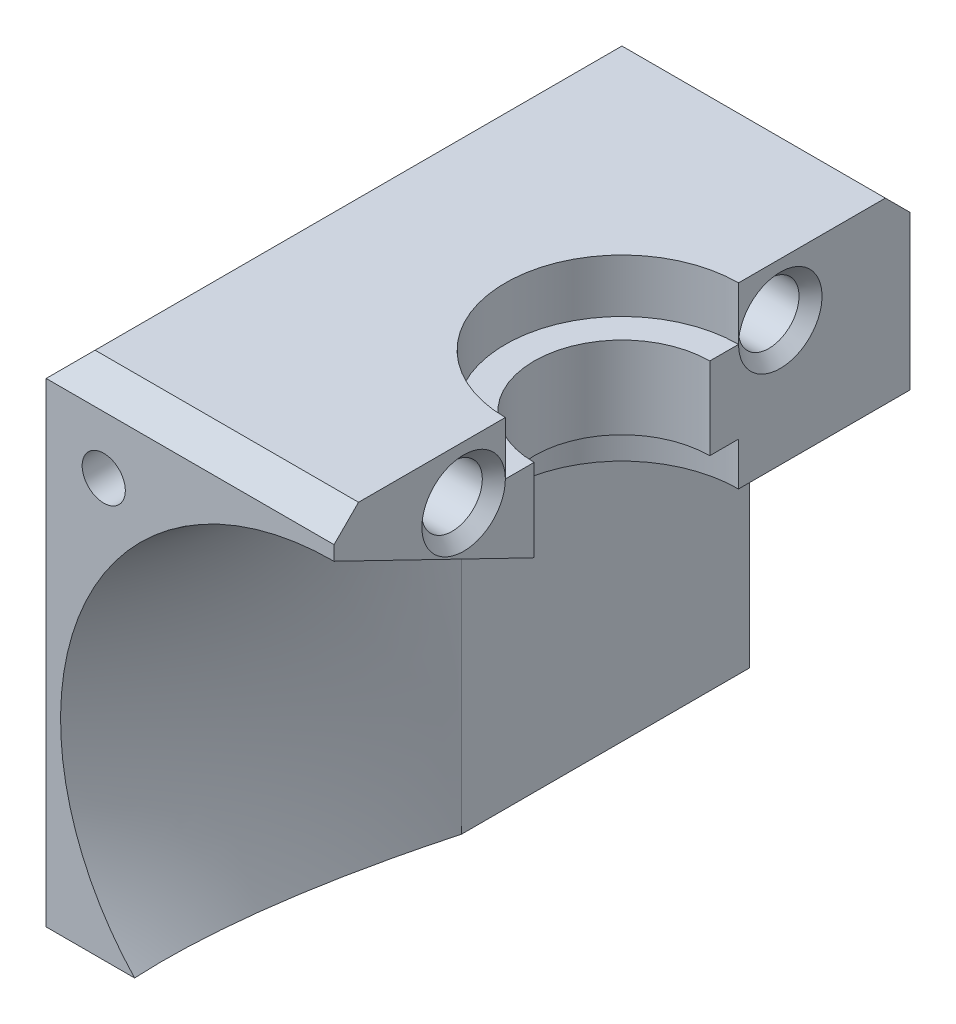
ISO-10303-21;
HEADER;
FILE_DESCRIPTION(('STEP AP214'),'2;1');
FILE_NAME('part.step','',(''),(''),'','','');
FILE_SCHEMA(('AUTOMOTIVE_DESIGN { 1 0 10303 214 1 1 1 1 }'));
ENDSEC;
DATA;
#1=APPLICATION_CONTEXT('core data for automotive mechanical design processes');
#2=APPLICATION_PROTOCOL_DEFINITION('international standard','automotive_design',2000,#1);
#3=PRODUCT_CONTEXT('',#1,'mechanical');
#4=PRODUCT('Part','Part','',(#3));
#5=PRODUCT_RELATED_PRODUCT_CATEGORY('part','',(#4));
#6=PRODUCT_DEFINITION_FORMATION('','',#4);
#7=PRODUCT_DEFINITION_CONTEXT('part definition',#1,'design');
#8=PRODUCT_DEFINITION('design','',#6,#7);
#9=PRODUCT_DEFINITION_SHAPE('','',#8);
#10=(LENGTH_UNIT() NAMED_UNIT(*) SI_UNIT(.MILLI.,.METRE.));
#11=(NAMED_UNIT(*) PLANE_ANGLE_UNIT() SI_UNIT($,.RADIAN.));
#12=(NAMED_UNIT(*) SI_UNIT($,.STERADIAN.) SOLID_ANGLE_UNIT());
#13=UNCERTAINTY_MEASURE_WITH_UNIT(LENGTH_MEASURE(1.E-05),#10,'distance_accuracy_value','');
#14=(GEOMETRIC_REPRESENTATION_CONTEXT(3) GLOBAL_UNCERTAINTY_ASSIGNED_CONTEXT((#13)) GLOBAL_UNIT_ASSIGNED_CONTEXT((#10,
#11,#12)) REPRESENTATION_CONTEXT('',''));
#15=CARTESIAN_POINT('',(0.,0.,0.));
#16=DIRECTION('',(0.,0.,1.));
#17=DIRECTION('',(1.,0.,0.));
#18=AXIS2_PLACEMENT_3D('',#15,#16,#17);
#19=CARTESIAN_POINT('',(20.,34.7,0.));
#20=DIRECTION('',(-1.,0.,0.));
#21=DIRECTION('',(0.,0.,1.));
#22=AXIS2_PLACEMENT_3D('',#19,#20,#21);
#23=PLANE('',#22);
#24=DIRECTION('',(0.,0.,-1.));
#25=VECTOR('',#24,1.);
#26=CARTESIAN_POINT('',(20.,31.,0.));
#27=LINE('',#26,#25);
#28=CARTESIAN_POINT('',(20.,31.,-11.9));
#29=VERTEX_POINT('',#28);
#30=CARTESIAN_POINT('',(20.,31.,-13.9));
#31=VERTEX_POINT('',#30);
#32=EDGE_CURVE('E460',#29,#31,#27,.T.);
#33=ORIENTED_EDGE('',*,*,#32,.F.);
#34=CARTESIAN_POINT('',(20.,31.,-9.));
#35=DIRECTION('',(-1.,0.,0.));
#36=DIRECTION('',(0.,0.,1.));
#37=AXIS2_PLACEMENT_3D('',#34,#35,#36);
#38=CIRCLE('',#37,2.9);
#39=EDGE_CURVE('E284',#29,#29,#38,.T.);
#40=ORIENTED_EDGE('',*,*,#39,.T.);
#41=DIRECTION('',(0.,1.,0.));
#42=VECTOR('',#41,1.);
#43=CARTESIAN_POINT('',(20.,31.,-11.9));
#44=LINE('',#43,#42);
#45=CARTESIAN_POINT('',(20.,34.7,-11.9));
#46=VERTEX_POINT('',#45);
#47=EDGE_CURVE('E465',#29,#46,#44,.T.);
#48=ORIENTED_EDGE('',*,*,#47,.T.);
#49=DIRECTION('',(0.,0.,-1.));
#50=VECTOR('',#49,1.);
#51=CARTESIAN_POINT('',(20.,34.7,0.));
#52=LINE('',#51,#50);
#53=CARTESIAN_POINT('',(20.,34.7,-1.69999999999999));
#54=VERTEX_POINT('',#53);
#55=EDGE_CURVE('E247',#54,#46,#52,.T.);
#56=ORIENTED_EDGE('',*,*,#55,.F.);
#57=DIRECTION('',(0.,0.707106781186549,-0.707106781186546));
#58=VECTOR('',#57,1.);
#59=CARTESIAN_POINT('',(20.,34.7,-1.69999999999999));
#60=LINE('',#59,#58);
#61=CARTESIAN_POINT('',(20.,33.,0.));
#62=VERTEX_POINT('',#61);
#63=EDGE_CURVE('E88',#54,#62,#60,.F.);
#64=ORIENTED_EDGE('',*,*,#63,.T.);
#65=DIRECTION('',(0.,-1.,0.));
#66=VECTOR('',#65,1.);
#67=CARTESIAN_POINT('',(20.,34.7,0.));
#68=LINE('',#67,#66);
#69=CARTESIAN_POINT('',(20.,32.,0.));
#70=VERTEX_POINT('',#69);
#71=EDGE_CURVE('E249',#62,#70,#68,.T.);
#72=ORIENTED_EDGE('',*,*,#71,.T.);
#73=CARTESIAN_POINT('',(20.,32.,0.));
#74=CARTESIAN_POINT('',(20.,30.8764166666667,-2.31666666666667));
#75=CARTESIAN_POINT('',(20.,29.7528333333333,-4.63333333333333));
#76=CARTESIAN_POINT('',(20.,27.5056666666667,-9.26666666666667));
#77=CARTESIAN_POINT('',(20.,26.3820833333333,-11.5833333333333));
#78=CARTESIAN_POINT('',(20.,25.2585,-13.9));
#79=B_SPLINE_CURVE_WITH_KNOTS('',3,(#73,#74,#75,#76,#77,#78),.UNSPECIFIED.,.F.,.F.,(4,2,4),(0.,
7.72427702523026,15.4485540504605),.UNSPECIFIED.);
#80=CARTESIAN_POINT('',(20.,25.3,-13.8144329896907));
#81=VERTEX_POINT('',#80);
#82=EDGE_CURVE('E326',#70,#81,#79,.T.);
#83=ORIENTED_EDGE('',*,*,#82,.T.);
#84=DIRECTION('',(0.,0.,-1.));
#85=VECTOR('',#84,1.);
#86=CARTESIAN_POINT('',(20.,25.3,0.));
#87=LINE('',#86,#85);
#88=CARTESIAN_POINT('',(20.,25.3,-13.9));
#89=VERTEX_POINT('',#88);
#90=EDGE_CURVE('E450',#81,#89,#87,.T.);
#91=ORIENTED_EDGE('',*,*,#90,.T.);
#92=DIRECTION('',(0.,1.,0.));
#93=VECTOR('',#92,1.);
#94=CARTESIAN_POINT('',(20.,-10.3,-13.9));
#95=LINE('',#94,#93);
#96=EDGE_CURVE('E471',#89,#31,#95,.T.);
#97=ORIENTED_EDGE('',*,*,#96,.T.);
#98=EDGE_LOOP('',(#33,#40,#48,#56,#64,#72,#83,#91,#97));
#99=FACE_BOUND('',#98,.T.);
#100=ADVANCED_FACE('F64',(#99),#23,.F.);
#101=DIRECTION('',(0.,1.,0.));
#102=VECTOR('',#101,1.);
#103=CARTESIAN_POINT('',(20.,31.,-28.1));
#104=LINE('',#103,#102);
#105=CARTESIAN_POINT('',(20.,34.7,-28.1));
#106=VERTEX_POINT('',#105);
#107=CARTESIAN_POINT('',(20.,31.,-28.1));
#108=VERTEX_POINT('',#107);
#109=EDGE_CURVE('E462',#106,#108,#104,.F.);
#110=ORIENTED_EDGE('',*,*,#109,.T.);
#111=CARTESIAN_POINT('',(20.,31.,-31.));
#112=DIRECTION('',(-1.,0.,0.));
#113=DIRECTION('',(0.,0.,1.));
#114=AXIS2_PLACEMENT_3D('',#111,#112,#113);
#115=CIRCLE('',#114,2.90000000000002);
#116=EDGE_CURVE('E12',#108,#108,#115,.T.);
#117=ORIENTED_EDGE('',*,*,#116,.T.);
#118=DIRECTION('',(0.,0.,-1.));
#119=VECTOR('',#118,1.);
#120=CARTESIAN_POINT('',(20.,31.,0.));
#121=LINE('',#120,#119);
#122=CARTESIAN_POINT('',(20.,31.,-26.1));
#123=VERTEX_POINT('',#122);
#124=EDGE_CURVE('E456',#123,#108,#121,.T.);
#125=ORIENTED_EDGE('',*,*,#124,.F.);
#126=DIRECTION('',(0.,1.,0.));
#127=VECTOR('',#126,1.);
#128=CARTESIAN_POINT('',(20.,-10.3,-26.1));
#129=LINE('',#128,#127);
#130=CARTESIAN_POINT('',(20.,25.3,-26.1));
#131=VERTEX_POINT('',#130);
#132=EDGE_CURVE('E468',#123,#131,#129,.F.);
#133=ORIENTED_EDGE('',*,*,#132,.T.);
#134=DIRECTION('',(0.,0.,-1.));
#135=VECTOR('',#134,1.);
#136=CARTESIAN_POINT('',(20.,25.3,0.));
#137=LINE('',#136,#135);
#138=CARTESIAN_POINT('',(20.,25.3,-28.1));
#139=VERTEX_POINT('',#138);
#140=EDGE_CURVE('E429',#131,#139,#137,.T.);
#141=ORIENTED_EDGE('',*,*,#140,.T.);
#142=DIRECTION('',(0.,1.,0.));
#143=VECTOR('',#142,1.);
#144=CARTESIAN_POINT('',(20.,22.3,-28.1));
#145=LINE('',#144,#143);
#146=CARTESIAN_POINT('',(20.,22.3,-28.1));
#147=VERTEX_POINT('',#146);
#148=EDGE_CURVE('E435',#139,#147,#145,.F.);
#149=ORIENTED_EDGE('',*,*,#148,.T.);
#150=DIRECTION('',(0.,0.,-1.));
#151=VECTOR('',#150,1.);
#152=CARTESIAN_POINT('',(20.,22.3,0.));
#153=LINE('',#152,#151);
#154=CARTESIAN_POINT('',(20.,22.3,-40.));
#155=VERTEX_POINT('',#154);
#156=EDGE_CURVE('E222',#147,#155,#153,.T.);
#157=ORIENTED_EDGE('',*,*,#156,.T.);
#158=DIRECTION('',(0.,-1.,0.));
#159=VECTOR('',#158,1.);
#160=CARTESIAN_POINT('',(20.,34.7,-40.));
#161=LINE('',#160,#159);
#162=CARTESIAN_POINT('',(20.,33.,-40.));
#163=VERTEX_POINT('',#162);
#164=EDGE_CURVE('E246',#163,#155,#161,.T.);
#165=ORIENTED_EDGE('',*,*,#164,.F.);
#166=DIRECTION('',(0.,-0.707106781186549,-0.707106781186546));
#167=VECTOR('',#166,1.);
#168=CARTESIAN_POINT('',(20.,34.7,-38.3));
#169=LINE('',#168,#167);
#170=CARTESIAN_POINT('',(20.,34.7,-38.3));
#171=VERTEX_POINT('',#170);
#172=EDGE_CURVE('E257',#163,#171,#169,.F.);
#173=ORIENTED_EDGE('',*,*,#172,.T.);
#174=EDGE_CURVE('E243',#106,#171,#52,.T.);
#175=ORIENTED_EDGE('',*,*,#174,.F.);
#176=EDGE_LOOP('',(#110,#117,#125,#133,#141,#149,#157,#165,#173,#175));
#177=FACE_BOUND('',#176,.T.);
#178=ADVANCED_FACE('F301',(#177),#23,.F.);
#179=CARTESIAN_POINT('',(20.,-10.3,-20.));
#180=DIRECTION('',(0.,1.,0.));
#181=DIRECTION('',(0.,0.,1.));
#182=AXIS2_PLACEMENT_3D('',#179,#180,#181);
#183=CYLINDRICAL_SURFACE('',#182,6.1);
#184=ORIENTED_EDGE('',*,*,#96,.F.);
#185=CARTESIAN_POINT('',(20.,25.3,-20.));
#186=DIRECTION('',(0.,1.,0.));
#187=DIRECTION('',(0.,0.,1.));
#188=AXIS2_PLACEMENT_3D('',#185,#186,#187);
#189=CIRCLE('',#188,6.1);
#190=EDGE_CURVE('E441',#89,#131,#189,.F.);
#191=ORIENTED_EDGE('',*,*,#190,.T.);
#192=ORIENTED_EDGE('',*,*,#132,.F.);
#193=CARTESIAN_POINT('',(20.,31.,-20.));
#194=DIRECTION('',(0.,1.,0.));
#195=DIRECTION('',(0.,0.,1.));
#196=AXIS2_PLACEMENT_3D('',#193,#194,#195);
#197=CIRCLE('',#196,6.1);
#198=EDGE_CURVE('E428',#31,#123,#197,.F.);
#199=ORIENTED_EDGE('',*,*,#198,.F.);
#200=EDGE_LOOP('',(#184,#191,#192,#199));
#201=FACE_BOUND('',#200,.T.);
#202=ADVANCED_FACE('F306',(#201),#183,.F.);
#203=CARTESIAN_POINT('',(0.,34.7,0.));
#204=DIRECTION('',(1.,0.,0.));
#205=DIRECTION('',(0.,0.,-1.));
#206=AXIS2_PLACEMENT_3D('',#203,#204,#205);
#207=PLANE('',#206);
#208=DIRECTION('',(0.,-1.,0.));
#209=VECTOR('',#208,1.);
#210=CARTESIAN_POINT('',(0.,34.7,0.));
#211=LINE('',#210,#209);
#212=CARTESIAN_POINT('',(0.,33.,0.));
#213=VERTEX_POINT('',#212);
#214=CARTESIAN_POINT('',(0.,0.,0.));
#215=VERTEX_POINT('',#214);
#216=EDGE_CURVE('E252',#213,#215,#211,.T.);
#217=ORIENTED_EDGE('',*,*,#216,.F.);
#218=DIRECTION('',(0.,0.,-1.));
#219=VECTOR('',#218,1.);
#220=CARTESIAN_POINT('',(0.,33.,0.));
#221=LINE('',#220,#219);
#222=CARTESIAN_POINT('',(0.,33.,-40.));
#223=VERTEX_POINT('',#222);
#224=EDGE_CURVE('E261',#213,#223,#221,.T.);
#225=ORIENTED_EDGE('',*,*,#224,.T.);
#226=DIRECTION('',(0.,-1.,0.));
#227=VECTOR('',#226,1.);
#228=CARTESIAN_POINT('',(0.,34.7,-40.));
#229=LINE('',#228,#227);
#230=CARTESIAN_POINT('',(0.,0.,-40.));
#231=VERTEX_POINT('',#230);
#232=EDGE_CURVE('E244',#223,#231,#229,.T.);
#233=ORIENTED_EDGE('',*,*,#232,.T.);
#234=DIRECTION('',(0.,0.,1.));
#235=VECTOR('',#234,1.);
#236=CARTESIAN_POINT('',(0.,0.,0.));
#237=LINE('',#236,#235);
#238=EDGE_CURVE('E235',#231,#215,#237,.T.);
#239=ORIENTED_EDGE('',*,*,#238,.T.);
#240=EDGE_LOOP('',(#217,#225,#233,#239));
#241=FACE_BOUND('',#240,.T.);
#242=ADVANCED_FACE('F389',(#241),#207,.F.);
#243=CARTESIAN_POINT('',(0.,34.7,0.));
#244=DIRECTION('',(0.,0.,-1.));
#245=DIRECTION('',(-1.,0.,0.));
#246=AXIS2_PLACEMENT_3D('',#243,#244,#245);
#247=PLANE('',#246);
#248=CARTESIAN_POINT('',(4.,29.,0.));
#249=DIRECTION('',(0.,0.,1.));
#250=DIRECTION('',(1.,0.,0.));
#251=AXIS2_PLACEMENT_3D('',#248,#249,#250);
#252=CIRCLE('',#251,1.5);
#253=CARTESIAN_POINT('',(5.5,29.,0.));
#254=VERTEX_POINT('',#253);
#255=EDGE_CURVE('E554',#254,#254,#252,.T.);
#256=ORIENTED_EDGE('',*,*,#255,.F.);
#257=EDGE_LOOP('',(#256));
#258=FACE_BOUND('',#257,.T.);
#259=ORIENTED_EDGE('',*,*,#71,.F.);
#260=DIRECTION('',(-1.,0.,0.));
#261=VECTOR('',#260,1.);
#262=CARTESIAN_POINT('',(0.,33.,0.));
#263=LINE('',#262,#261);
#264=EDGE_CURVE('E80',#62,#213,#263,.T.);
#265=ORIENTED_EDGE('',*,*,#264,.T.);
#266=ORIENTED_EDGE('',*,*,#216,.T.);
#267=DIRECTION('',(1.,0.,0.));
#268=VECTOR('',#267,1.);
#269=CARTESIAN_POINT('',(0.,0.,0.));
#270=LINE('',#269,#268);
#271=CARTESIAN_POINT('',(6.14342922549833,2.45850939839488E-08,0.));
#272=VERTEX_POINT('',#271);
#273=EDGE_CURVE('E230',#215,#272,#270,.T.);
#274=ORIENTED_EDGE('',*,*,#273,.T.);
#275=CARTESIAN_POINT('',(20.,13.,0.));
#276=DIRECTION('',(0.,0.,1.));
#277=DIRECTION('',(1.,0.,0.));
#278=AXIS2_PLACEMENT_3D('',#275,#276,#277);
#279=CIRCLE('',#278,19.);
#280=CARTESIAN_POINT('',(8.49295391360988,28.1191233332391,0.));
#281=VERTEX_POINT('',#280);
#282=EDGE_CURVE('E203',#281,#272,#279,.T.);
#283=ORIENTED_EDGE('',*,*,#282,.F.);
#284=EDGE_CURVE('E201',#70,#281,#279,.T.);
#285=ORIENTED_EDGE('',*,*,#284,.F.);
#286=EDGE_LOOP('',(#259,#265,#266,#274,#283,#285));
#287=FACE_BOUND('',#286,.T.);
#288=ADVANCED_FACE('F314',(#258,#287),#247,.F.);
#289=CARTESIAN_POINT('',(0.,34.7,-40.));
#290=DIRECTION('',(0.,0.,1.));
#291=DIRECTION('',(1.,0.,0.));
#292=AXIS2_PLACEMENT_3D('',#289,#290,#291);
#293=PLANE('',#292);
#294=ORIENTED_EDGE('',*,*,#232,.F.);
#295=DIRECTION('',(1.,0.,0.));
#296=VECTOR('',#295,1.);
#297=CARTESIAN_POINT('',(0.,33.,-40.));
#298=LINE('',#297,#296);
#299=EDGE_CURVE('E484',#223,#163,#298,.T.);
#300=ORIENTED_EDGE('',*,*,#299,.T.);
#301=ORIENTED_EDGE('',*,*,#164,.T.);
#302=DIRECTION('',(1.,0.,0.));
#303=VECTOR('',#302,1.);
#304=CARTESIAN_POINT('',(8.85000000000001,22.3,-40.));
#305=LINE('',#304,#303);
#306=CARTESIAN_POINT('',(8.85000000000001,22.3,-40.));
#307=VERTEX_POINT('',#306);
#308=EDGE_CURVE('E189',#307,#155,#305,.T.);
#309=ORIENTED_EDGE('',*,*,#308,.F.);
#310=DIRECTION('',(0.,-1.,0.));
#311=VECTOR('',#310,1.);
#312=CARTESIAN_POINT('',(8.85000000000001,45.1980894399511,-40.));
#313=LINE('',#312,#311);
#314=CARTESIAN_POINT('',(8.85000000000001,0.,-40.));
#315=VERTEX_POINT('',#314);
#316=EDGE_CURVE('E219',#307,#315,#313,.T.);
#317=ORIENTED_EDGE('',*,*,#316,.T.);
#318=DIRECTION('',(-1.,0.,0.));
#319=VECTOR('',#318,1.);
#320=CARTESIAN_POINT('',(0.,0.,-40.));
#321=LINE('',#320,#319);
#322=EDGE_CURVE('E234',#315,#231,#321,.T.);
#323=ORIENTED_EDGE('',*,*,#322,.T.);
#324=EDGE_LOOP('',(#294,#300,#301,#309,#317,#323));
#325=FACE_BOUND('',#324,.T.);
#326=ADVANCED_FACE('F312',(#325),#293,.F.);
#327=CARTESIAN_POINT('',(0.,34.7,0.));
#328=DIRECTION('',(0.,-1.,0.));
#329=DIRECTION('',(0.,0.,-1.));
#330=AXIS2_PLACEMENT_3D('',#327,#328,#329);
#331=PLANE('',#330);
#332=ORIENTED_EDGE('',*,*,#174,.T.);
#333=DIRECTION('',(-1.,0.,0.));
#334=VECTOR('',#333,1.);
#335=CARTESIAN_POINT('',(0.,34.7,-38.3));
#336=LINE('',#335,#334);
#337=CARTESIAN_POINT('',(1.69999999999999,34.7,-38.3));
#338=VERTEX_POINT('',#337);
#339=EDGE_CURVE('E477',#171,#338,#336,.T.);
#340=ORIENTED_EDGE('',*,*,#339,.T.);
#341=DIRECTION('',(0.,0.,1.));
#342=VECTOR('',#341,1.);
#343=CARTESIAN_POINT('',(1.69999999999999,34.7,0.));
#344=LINE('',#343,#342);
#345=CARTESIAN_POINT('',(1.69999999999999,34.7,-1.69999999999999));
#346=VERTEX_POINT('',#345);
#347=EDGE_CURVE('E439',#338,#346,#344,.T.);
#348=ORIENTED_EDGE('',*,*,#347,.T.);
#349=DIRECTION('',(1.,0.,0.));
#350=VECTOR('',#349,1.);
#351=CARTESIAN_POINT('',(0.,34.7,-1.69999999999999));
#352=LINE('',#351,#350);
#353=EDGE_CURVE('E485',#346,#54,#352,.T.);
#354=ORIENTED_EDGE('',*,*,#353,.T.);
#355=ORIENTED_EDGE('',*,*,#55,.T.);
#356=CARTESIAN_POINT('',(20.,34.7,-20.));
#357=DIRECTION('',(0.,1.,0.));
#358=DIRECTION('',(0.,0.,1.));
#359=AXIS2_PLACEMENT_3D('',#356,#357,#358);
#360=CIRCLE('',#359,8.1);
#361=EDGE_CURVE('E452',#106,#46,#360,.T.);
#362=ORIENTED_EDGE('',*,*,#361,.F.);
#363=EDGE_LOOP('',(#332,#340,#348,#354,#355,#362));
#364=FACE_BOUND('',#363,.T.);
#365=ADVANCED_FACE('F391',(#364),#331,.F.);
#366=CARTESIAN_POINT('',(0.,0.,0.));
#367=DIRECTION('',(0.,-1.,0.));
#368=DIRECTION('',(0.,0.,-1.));
#369=AXIS2_PLACEMENT_3D('',#366,#367,#368);
#370=PLANE('',#369);
#371=CARTESIAN_POINT('',(3.49999999999999,0.,-36.));
#372=DIRECTION('',(0.,-1.,0.));
#373=DIRECTION('',(0.,0.,-1.));
#374=AXIS2_PLACEMENT_3D('',#371,#372,#373);
#375=CIRCLE('',#374,3.10000000000001);
#376=CARTESIAN_POINT('',(3.49999999999999,0.,-39.1));
#377=VERTEX_POINT('',#376);
#378=EDGE_CURVE('E275',#377,#377,#375,.F.);
#379=ORIENTED_EDGE('',*,*,#378,.T.);
#380=EDGE_LOOP('',(#379));
#381=FACE_BOUND('',#380,.T.);
#382=CARTESIAN_POINT('',(3.49999999999999,0.,-19.));
#383=DIRECTION('',(0.,-1.,0.));
#384=DIRECTION('',(0.,0.,-1.));
#385=AXIS2_PLACEMENT_3D('',#382,#383,#384);
#386=CIRCLE('',#385,3.10000000000001);
#387=CARTESIAN_POINT('',(3.49999999999999,0.,-22.1));
#388=VERTEX_POINT('',#387);
#389=EDGE_CURVE('E272',#388,#388,#386,.F.);
#390=ORIENTED_EDGE('',*,*,#389,.T.);
#391=EDGE_LOOP('',(#390));
#392=FACE_BOUND('',#391,.T.);
#393=CARTESIAN_POINT('',(6.1436543992523,0.,0.));
#394=CARTESIAN_POINT('',(6.12513346566198,0.,-0.340166992302829));
#395=CARTESIAN_POINT('',(6.11158100961271,0.,-0.680580115471501));
#396=CARTESIAN_POINT('',(6.09361857966211,0.,-1.36151830111218));
#397=CARTESIAN_POINT('',(6.08920504438543,0.,-1.7020432682391));
#398=CARTESIAN_POINT('',(6.08871281381805,0.,-2.3830580914974));
#399=CARTESIAN_POINT('',(6.09263332833503,0.,-2.72354794789666));
#400=CARTESIAN_POINT('',(6.10814741229103,0.,-3.40376240997918));
#401=CARTESIAN_POINT('',(6.1197277586065,0.,-3.74348732385466));
#402=CARTESIAN_POINT('',(6.14997844587531,0.,-4.42265033036536));
#403=CARTESIAN_POINT('',(6.16864946177287,0.,-4.76208839261221));
#404=CARTESIAN_POINT('',(6.21258676787472,0.,-5.44054297362212));
#405=CARTESIAN_POINT('',(6.2378532555835,0.,-5.77955947945596));
#406=CARTESIAN_POINT('',(6.30865111469121,0.,-6.6256377268567));
#407=CARTESIAN_POINT('',(6.35801031813204,0.,-7.13238167576031));
#408=CARTESIAN_POINT('',(6.46930914597948,0.,-8.1445050958401));
#409=CARTESIAN_POINT('',(6.53124959719782,0.,-8.64988447512685));
#410=CARTESIAN_POINT('',(6.66674470255129,0.,-9.65951272334807));
#411=CARTESIAN_POINT('',(6.74030912057419,0.,-10.1637602771627));
#412=CARTESIAN_POINT('',(6.89815115039732,0.,-11.1705765230704));
#413=CARTESIAN_POINT('',(6.98242888159814,0.,-11.6731451963883));
#414=CARTESIAN_POINT('',(7.14989518963691,0.,-12.6142964587994));
#415=CARTESIAN_POINT('',(7.23192316606735,0.,-13.0530864351328));
#416=CARTESIAN_POINT('',(7.40321341515976,0.,-13.9292610539186));
#417=CARTESIAN_POINT('',(7.49247585074839,0.,-14.3666456644902));
#418=CARTESIAN_POINT('',(7.67786006816094,0.,-15.2399727434445));
#419=CARTESIAN_POINT('',(7.77398209000431,0.,-15.6759151608054));
#420=CARTESIAN_POINT('',(7.9725676148239,0.,-16.545509502974));
#421=CARTESIAN_POINT('',(8.07501914726523,0.,-16.979164163976));
#422=CARTESIAN_POINT('',(8.2861211164418,0.,-17.844941089954));
#423=CARTESIAN_POINT('',(8.39477129392794,0.,-18.2770634182157));
#424=CARTESIAN_POINT('',(8.61800106987783,0.,-19.1397170664669));
#425=CARTESIAN_POINT('',(8.73257992938602,0.,-19.5702485776044));
#426=CARTESIAN_POINT('',(8.85,0.,-20.));
#427=B_SPLINE_CURVE_WITH_KNOTS('',3,(#393,#394,#395,#396,#397,#398,#399,#400,#401,#402,#403,
#404,#405,#406,#407,#408,#409,#410,#411,#412,#413,#414,#415,#416,#417,#418,#419,#420,#421,#422,
#423,#424,#425,#426),.UNSPECIFIED.,.F.,.F.,(4,2,2,2,2,2,2,2,2,2,2,2,2,2,2,2,4),(0.,
1.02194062335354,2.04348292838071,3.06492838026923,4.08461510274797,5.10439891115504,
6.12421326097004,7.65145508532137,9.17879730911185,10.7074293559077,12.2360784409045,
13.5751903827724,14.9143324910559,16.2535214794104,17.5902510049911,18.9269246647793,
20.2634321199712),.UNSPECIFIED.);
#428=CARTESIAN_POINT('',(8.85,0.,-20.));
#429=VERTEX_POINT('',#428);
#430=EDGE_CURVE('E183',#272,#429,#427,.T.);
#431=ORIENTED_EDGE('',*,*,#430,.F.);
#432=ORIENTED_EDGE('',*,*,#273,.F.);
#433=ORIENTED_EDGE('',*,*,#238,.F.);
#434=ORIENTED_EDGE('',*,*,#322,.F.);
#435=DIRECTION('',(0.,0.,-1.));
#436=VECTOR('',#435,1.);
#437=CARTESIAN_POINT('',(8.85,0.,-20.));
#438=LINE('',#437,#436);
#439=EDGE_CURVE('E425',#429,#315,#438,.T.);
#440=ORIENTED_EDGE('',*,*,#439,.F.);
#441=EDGE_LOOP('',(#431,#432,#433,#434,#440));
#442=FACE_BOUND('',#441,.T.);
#443=ADVANCED_FACE('F385',(#381,#392,#442),#370,.T.);
#444=CARTESIAN_POINT('',(20.,31.,-20.));
#445=DIRECTION('',(0.,1.,0.));
#446=DIRECTION('',(0.,0.,1.));
#447=AXIS2_PLACEMENT_3D('',#444,#445,#446);
#448=CYLINDRICAL_SURFACE('',#447,8.1);
#449=CARTESIAN_POINT('',(20.,31.,-20.));
#450=DIRECTION('',(0.,1.,0.));
#451=DIRECTION('',(0.,0.,1.));
#452=AXIS2_PLACEMENT_3D('',#449,#450,#451);
#453=CIRCLE('',#452,8.1);
#454=EDGE_CURVE('E453',#108,#29,#453,.T.);
#455=ORIENTED_EDGE('',*,*,#454,.F.);
#456=ORIENTED_EDGE('',*,*,#109,.F.);
#457=ORIENTED_EDGE('',*,*,#361,.T.);
#458=ORIENTED_EDGE('',*,*,#47,.F.);
#459=EDGE_LOOP('',(#455,#456,#457,#458));
#460=FACE_BOUND('',#459,.T.);
#461=ADVANCED_FACE('F381',(#460),#448,.F.);
#462=CARTESIAN_POINT('',(20.,31.,-20.));
#463=DIRECTION('',(0.,1.,0.));
#464=DIRECTION('',(0.,0.,1.));
#465=AXIS2_PLACEMENT_3D('',#462,#463,#464);
#466=PLANE('',#465);
#467=ORIENTED_EDGE('',*,*,#32,.T.);
#468=ORIENTED_EDGE('',*,*,#198,.T.);
#469=ORIENTED_EDGE('',*,*,#124,.T.);
#470=ORIENTED_EDGE('',*,*,#454,.T.);
#471=EDGE_LOOP('',(#467,#468,#469,#470));
#472=FACE_BOUND('',#471,.T.);
#473=ADVANCED_FACE('F376',(#472),#466,.T.);
#474=CARTESIAN_POINT('',(20.,22.3,-20.));
#475=DIRECTION('',(0.,1.,0.));
#476=DIRECTION('',(0.,0.,1.));
#477=AXIS2_PLACEMENT_3D('',#474,#475,#476);
#478=CYLINDRICAL_SURFACE('',#477,8.1);
#479=CARTESIAN_POINT('',(20.,25.3,-20.));
#480=DIRECTION('',(0.,1.,0.));
#481=DIRECTION('',(0.,0.,1.));
#482=AXIS2_PLACEMENT_3D('',#479,#480,#481);
#483=CIRCLE('',#482,8.1);
#484=CARTESIAN_POINT('',(15.3706554459452,25.3,-13.3532587684008));
#485=VERTEX_POINT('',#484);
#486=EDGE_CURVE('E442',#139,#485,#483,.T.);
#487=ORIENTED_EDGE('',*,*,#486,.T.);
#488=CARTESIAN_POINT('',(15.370655445945,25.3,-13.3532587684008));
#489=CARTESIAN_POINT('',(15.2366600156251,25.2447352813302,-13.4465851605639));
#490=CARTESIAN_POINT('',(15.1058933447916,25.188051038787,-13.5436785206281));
#491=CARTESIAN_POINT('',(14.8511135355263,25.0723860548799,-13.7449765762742));
#492=CARTESIAN_POINT('',(14.7270976569774,25.0134062621946,-13.8491783472974));
#493=CARTESIAN_POINT('',(14.4860162086444,24.8936520200705,-14.0643379811062));
#494=CARTESIAN_POINT('',(14.3689500194165,24.832877731305,-14.1752952399665));
#495=CARTESIAN_POINT('',(14.1420647065828,24.7100325857871,-14.4035306791706));
#496=CARTESIAN_POINT('',(14.0322405861084,24.6479626627618,-14.52080439761));
#497=CARTESIAN_POINT('',(13.819968079133,24.5228955650559,-14.7613989214317));
#498=CARTESIAN_POINT('',(13.7175202976576,24.4598983148228,-14.88472022146));
#499=CARTESIAN_POINT('',(13.5202475176904,24.3333451004747,-15.1370319529306));
#500=CARTESIAN_POINT('',(13.4254226613329,24.2697891259662,-15.2660224900101));
#501=CARTESIAN_POINT('',(13.198288489576,24.1106593135111,-15.5949815447081));
#502=CARTESIAN_POINT('',(13.0708625318481,24.0149212140706,-15.798272924694));
#503=CARTESIAN_POINT('',(12.8344818964148,23.8236904802599,-16.2154460684395));
#504=CARTESIAN_POINT('',(12.7255296619568,23.7281978800005,-16.4293292281924));
#505=CARTESIAN_POINT('',(12.526984020995,23.5380465919506,-16.8660717984261));
#506=CARTESIAN_POINT('',(12.4373773585751,23.4433873760457,-17.0889249375011));
#507=CARTESIAN_POINT('',(12.2782138980702,23.2551360923931,-17.5420109587598));
#508=CARTESIAN_POINT('',(12.2086529962402,23.1615438099975,-17.772242319743));
#509=CARTESIAN_POINT('',(12.0668591092855,22.9386853742724,-18.3304041204224));
#510=CARTESIAN_POINT('',(12.0043739155944,22.8098942403415,-18.6610842109063));
#511=CARTESIAN_POINT('',(11.9418052969512,22.6179759428594,-19.1610888395038));
#512=CARTESIAN_POINT('',(11.9261423049355,22.5542270324012,-19.3283877245325));
#513=CARTESIAN_POINT('',(11.9052384551038,22.426969724364,-19.6637671151372));
#514=CARTESIAN_POINT('',(11.8999998059403,22.3634613805994,-19.8318477787926));
#515=CARTESIAN_POINT('',(11.9,22.3,-20.));
#516=B_SPLINE_CURVE_WITH_KNOTS('',3,(#488,#489,#490,#491,#492,#493,#494,#495,#496,#497,#498,
#499,#500,#501,#502,#503,#504,#505,#506,#507,#508,#509,#510,#511,#512,#513,#514,#515),
.UNSPECIFIED.,.F.,.F.,(4,2,2,2,2,2,2,2,2,2,2,2,2,4),(0.,0.51707485740921,1.0339382469905,
1.55075549782048,2.06721234203258,2.5837114991706,3.10022028453406,3.87425549779754,
4.6483930015946,5.42199835764565,6.19544522941141,7.27366333586623,7.81255974545319,
8.3515703213117),.UNSPECIFIED.);
#517=CARTESIAN_POINT('',(11.9,22.3,-20.));
#518=VERTEX_POINT('',#517);
#519=EDGE_CURVE('E370',#485,#518,#516,.T.);
#520=ORIENTED_EDGE('',*,*,#519,.T.);
#521=CARTESIAN_POINT('',(20.,22.3,-20.));
#522=DIRECTION('',(0.,1.,0.));
#523=DIRECTION('',(0.,0.,1.));
#524=AXIS2_PLACEMENT_3D('',#521,#522,#523);
#525=CIRCLE('',#524,8.1);
#526=EDGE_CURVE('E212',#147,#518,#525,.T.);
#527=ORIENTED_EDGE('',*,*,#526,.F.);
#528=ORIENTED_EDGE('',*,*,#148,.F.);
#529=EDGE_LOOP('',(#487,#520,#527,#528));
#530=FACE_BOUND('',#529,.T.);
#531=ADVANCED_FACE('F371',(#530),#478,.F.);
#532=CARTESIAN_POINT('',(20.,25.3,-20.));
#533=DIRECTION('',(0.,1.,0.));
#534=DIRECTION('',(0.,0.,1.));
#535=AXIS2_PLACEMENT_3D('',#532,#533,#534);
#536=PLANE('',#535);
#537=ORIENTED_EDGE('',*,*,#90,.F.);
#538=CARTESIAN_POINT('',(20.,25.3,-13.8144329896907));
#539=CARTESIAN_POINT('',(19.7431494121221,25.3,-13.8144028029338));
#540=CARTESIAN_POINT('',(19.4862949467071,25.3,-13.8103953698839));
#541=CARTESIAN_POINT('',(18.9721877177831,25.3,-13.7942748611255));
#542=CARTESIAN_POINT('',(18.7149356011561,25.3,-13.7821412101292));
#543=CARTESIAN_POINT('',(18.2005746861983,25.3,-13.7495920839718));
#544=CARTESIAN_POINT('',(17.9434666486635,25.3,-13.7291645138076));
#545=CARTESIAN_POINT('',(17.4299490454542,25.3,-13.6796473441877));
#546=CARTESIAN_POINT('',(17.1735398986776,25.3,-13.6505533702014));
#547=CARTESIAN_POINT('',(16.6672558578445,25.3,-13.5839164934169));
#548=CARTESIAN_POINT('',(16.4173562136831,25.3,-13.546562450251));
#549=CARTESIAN_POINT('',(15.9192582980371,25.3,-13.4626073003864));
#550=CARTESIAN_POINT('',(15.6710591055288,25.3,-13.4160116902444));
#551=CARTESIAN_POINT('',(15.1769085885901,25.3,-13.3129188061274));
#552=CARTESIAN_POINT('',(14.9309557393719,25.3,-13.2564288704779));
#553=CARTESIAN_POINT('',(14.4418643982957,25.3,-13.1326957173173));
#554=CARTESIAN_POINT('',(14.1987246269159,25.3,-13.0654576128034));
#555=CARTESIAN_POINT('',(13.8373836243077,25.3,-12.9560295652923));
#556=CARTESIAN_POINT('',(13.717836590163,25.3,-12.9182457397651));
#557=CARTESIAN_POINT('',(13.4797387367074,25.3,-12.8396699215695));
#558=CARTESIAN_POINT('',(13.3611878637455,25.3,-12.7988780920772));
#559=CARTESIAN_POINT('',(13.1252218941734,25.3,-12.7141671164349));
#560=CARTESIAN_POINT('',(13.0078066794133,25.3,-12.6702482996685));
#561=CARTESIAN_POINT('',(12.7733514087772,25.3,-12.5788067071409));
#562=CARTESIAN_POINT('',(12.6563210844074,25.3,-12.5312589446911));
#563=CARTESIAN_POINT('',(12.4236968754121,25.3,-12.4327230697162));
#564=CARTESIAN_POINT('',(12.3081031821528,25.3,-12.3817345045543));
#565=CARTESIAN_POINT('',(12.078501964422,25.3,-12.2761760297063));
#566=CARTESIAN_POINT('',(11.9644951631654,25.3,-12.2216045479795));
#567=CARTESIAN_POINT('',(11.8514,25.3,-12.1651907579892));
#568=B_SPLINE_CURVE_WITH_KNOTS('',3,(#538,#539,#540,#541,#542,#543,#544,#545,#546,#547,#548,
#549,#550,#551,#552,#553,#554,#555,#556,#557,#558,#559,#560,#561,#562,#563,#564,#565,#566,#567),
.UNSPECIFIED.,.F.,.F.,(4,2,2,2,2,2,2,2,2,2,2,2,2,2,4),(0.,0.770527238909067,1.54301283776648,
2.31662902003874,3.09063636328782,3.84850151502997,4.60591725987438,5.36277361260246,
6.11927098782782,6.49536570814231,6.87144004133339,7.24747481889585,7.62638454934599,
8.00534422281944,8.3844712944316),.UNSPECIFIED.);
#569=EDGE_CURVE('E357',#81,#485,#568,.T.);
#570=ORIENTED_EDGE('',*,*,#569,.T.);
#571=ORIENTED_EDGE('',*,*,#486,.F.);
#572=ORIENTED_EDGE('',*,*,#140,.F.);
#573=ORIENTED_EDGE('',*,*,#190,.F.);
#574=EDGE_LOOP('',(#537,#570,#571,#572,#573));
#575=FACE_BOUND('',#574,.T.);
#576=ADVANCED_FACE('F375',(#575),#536,.F.);
#577=CARTESIAN_POINT('',(20.,22.3,-20.));
#578=DIRECTION('',(0.,1.,0.));
#579=DIRECTION('',(0.,0.,1.));
#580=AXIS2_PLACEMENT_3D('',#577,#578,#579);
#581=PLANE('',#580);
#582=ORIENTED_EDGE('',*,*,#526,.T.);
#583=DIRECTION('',(1.,0.,0.));
#584=VECTOR('',#583,1.);
#585=CARTESIAN_POINT('',(8.85000000000001,22.3,-20.));
#586=LINE('',#585,#584);
#587=CARTESIAN_POINT('',(8.85000000000001,22.3,-20.));
#588=VERTEX_POINT('',#587);
#589=EDGE_CURVE('E196',#588,#518,#586,.T.);
#590=ORIENTED_EDGE('',*,*,#589,.F.);
#591=DIRECTION('',(0.,0.,-1.));
#592=VECTOR('',#591,1.);
#593=CARTESIAN_POINT('',(8.85,22.3,-20.));
#594=LINE('',#593,#592);
#595=EDGE_CURVE('E188',#588,#307,#594,.T.);
#596=ORIENTED_EDGE('',*,*,#595,.T.);
#597=ORIENTED_EDGE('',*,*,#308,.T.);
#598=ORIENTED_EDGE('',*,*,#156,.F.);
#599=EDGE_LOOP('',(#582,#590,#596,#597,#598));
#600=FACE_BOUND('',#599,.T.);
#601=ADVANCED_FACE('F208',(#600),#581,.F.);
#602=CARTESIAN_POINT('',(8.85,45.1980894399511,-20.));
#603=DIRECTION('',(-1.,0.,0.));
#604=DIRECTION('',(0.,0.,1.));
#605=AXIS2_PLACEMENT_3D('',#602,#603,#604);
#606=PLANE('',#605);
#607=CARTESIAN_POINT('',(8.85,-7.,-20.));
#608=CARTESIAN_POINT('',(8.85,-5.77916666666667,-20.));
#609=CARTESIAN_POINT('',(8.85,-4.55833333333334,-20.));
#610=CARTESIAN_POINT('',(8.85,-2.11666666666668,-20.));
#611=CARTESIAN_POINT('',(8.85,-0.895833333333351,-20.));
#612=CARTESIAN_POINT('',(8.85,1.54583333333331,-20.));
#613=CARTESIAN_POINT('',(8.85,2.76666666666664,-20.));
#614=CARTESIAN_POINT('',(8.85,5.20833333333331,-20.));
#615=CARTESIAN_POINT('',(8.85,6.42916666666665,-20.));
#616=CARTESIAN_POINT('',(8.85,8.87083333333331,-20.));
#617=CARTESIAN_POINT('',(8.85,10.0916666666666,-20.));
#618=CARTESIAN_POINT('',(8.85,12.5333333333333,-20.));
#619=CARTESIAN_POINT('',(8.85000000000001,13.7541666666666,-20.));
#620=CARTESIAN_POINT('',(8.85000000000001,16.1958333333333,-20.));
#621=CARTESIAN_POINT('',(8.85000000000001,17.4166666666667,-20.));
#622=CARTESIAN_POINT('',(8.85000000000001,19.8583333333333,-20.));
#623=CARTESIAN_POINT('',(8.85000000000001,21.0791666666667,-20.));
#624=CARTESIAN_POINT('',(8.85000000000001,22.3,-20.));
#625=B_SPLINE_CURVE_WITH_KNOTS('',3,(#607,#608,#609,#610,#611,#612,#613,#614,#615,#616,#617,
#618,#619,#620,#621,#622,#623,#624),.UNSPECIFIED.,.F.,.F.,(4,2,2,2,2,2,2,2,4),(0.,0.125,0.25,
0.375,0.5,0.625,0.75,0.875,1.),.UNSPECIFIED.);
#626=EDGE_CURVE('E176',#588,#429,#625,.F.);
#627=ORIENTED_EDGE('',*,*,#626,.T.);
#628=ORIENTED_EDGE('',*,*,#439,.T.);
#629=ORIENTED_EDGE('',*,*,#316,.F.);
#630=ORIENTED_EDGE('',*,*,#595,.F.);
#631=EDGE_LOOP('',(#627,#628,#629,#630));
#632=FACE_BOUND('',#631,.T.);
#633=ADVANCED_FACE('F217',(#632),#606,.F.);
#634=CARTESIAN_POINT('',(31.15,22.3,-20.));
#635=CARTESIAN_POINT('',(31.5070460863901,28.1191233332391,0.));
#636=CARTESIAN_POINT('',(30.2208333333333,22.3,-20.));
#637=CARTESIAN_POINT('',(30.7439914855945,28.6998782000562,0.));
#638=CARTESIAN_POINT('',(29.2916666666667,22.3,-20.));
#639=CARTESIAN_POINT('',(29.9169795422165,29.2376436463025,0.));
#640=CARTESIAN_POINT('',(27.4333333333333,22.3,-20.));
#641=CARTESIAN_POINT('',(28.1508823599349,30.1921688910838,0.));
#642=CARTESIAN_POINT('',(26.5041666666666,22.3,-20.));
#643=CARTESIAN_POINT('',(27.2118131525906,30.608752260788,0.));
#644=CARTESIAN_POINT('',(24.6458333333333,22.3,-20.));
#645=CARTESIAN_POINT('',(25.2497412719104,31.2898502374319,0.));
#646=CARTESIAN_POINT('',(23.7166666666666,22.3,-20.));
#647=CARTESIAN_POINT('',(24.2268448055574,31.554200216982,0.));
#648=CARTESIAN_POINT('',(21.8583333333333,22.3,-20.));
#649=CARTESIAN_POINT('',(22.1358792397187,31.9093252808095,0.));
#650=CARTESIAN_POINT('',(20.9291666666666,22.3,-20.));
#651=CARTESIAN_POINT('',(21.0679928355038,32.,0.));
#652=CARTESIAN_POINT('',(19.0708333333333,22.3,-20.));
#653=CARTESIAN_POINT('',(18.9320071644963,32.,0.));
#654=CARTESIAN_POINT('',(18.1416666666666,22.3,-20.));
#655=CARTESIAN_POINT('',(17.8641207602813,31.9093252808095,0.));
#656=CARTESIAN_POINT('',(16.2833333333333,22.3,-20.));
#657=CARTESIAN_POINT('',(15.7731551944426,31.554200216982,0.));
#658=CARTESIAN_POINT('',(15.3541666666666,22.3,-20.));
#659=CARTESIAN_POINT('',(14.7502587280896,31.2898502374319,0.));
#660=CARTESIAN_POINT('',(13.4958333333333,22.3,-20.));
#661=CARTESIAN_POINT('',(12.7881868474094,30.608752260788,0.));
#662=CARTESIAN_POINT('',(12.5666666666666,22.3,-20.));
#663=CARTESIAN_POINT('',(11.8491176400651,30.1921688910838,0.));
#664=CARTESIAN_POINT('',(10.7083333333333,22.3,-20.));
#665=CARTESIAN_POINT('',(10.0830204577835,29.2376436463025,0.));
#666=CARTESIAN_POINT('',(9.77916666666667,22.3,-20.));
#667=CARTESIAN_POINT('',(9.25600851440548,28.6998782000562,0.));
#668=CARTESIAN_POINT('',(8.85000000000001,22.3,-20.));
#669=CARTESIAN_POINT('',(8.49295391360988,28.1191233332391,0.));
#670=B_SPLINE_SURFACE_WITH_KNOTS('',3,1,((#634,#635),(#636,#637),(#638,#639),(#640,#641),(#642,
#643),(#644,#645),(#646,#647),(#648,#649),(#650,#651),(#652,#653),(#654,#655),(#656,#657),(#658,
#659),(#660,#661),(#662,#663),(#664,#665),(#666,#667),(#668,#669)),.UNSPECIFIED.,.F.,.F.,.F.,(4,
2,2,2,2,2,2,2,4),(2,2),(0.,0.125,0.25,0.375,0.5,0.625,0.75,0.875,1.),(0.,1.),.UNSPECIFIED.);
#671=DIRECTION('',(-0.0171389644031273,0.279330180241261,0.960042137776032));
#672=VECTOR('',#671,1.);
#673=CARTESIAN_POINT('',(8.67147695680494,25.2095616666195,-10.));
#674=LINE('',#673,#672);
#675=EDGE_CURVE('E180',#588,#281,#674,.T.);
#676=ORIENTED_EDGE('',*,*,#284,.T.);
#677=ORIENTED_EDGE('',*,*,#675,.F.);
#678=ORIENTED_EDGE('',*,*,#589,.T.);
#679=ORIENTED_EDGE('',*,*,#519,.F.);
#680=ORIENTED_EDGE('',*,*,#569,.F.);
#681=ORIENTED_EDGE('',*,*,#82,.F.);
#682=EDGE_LOOP('',(#676,#677,#678,#679,#680,#681));
#683=FACE_BOUND('',#682,.T.);
#684=ADVANCED_FACE('F195',(#683),#670,.F.);
#685=CARTESIAN_POINT('',(8.85000000000001,22.3,-20.));
#686=CARTESIAN_POINT('',(8.49295391360988,28.1191233332391,0.));
#687=CARTESIAN_POINT('',(8.85000000000001,21.0791666666667,-20.));
#688=CARTESIAN_POINT('',(7.49037544709368,27.3560687324435,0.));
#689=CARTESIAN_POINT('',(8.85000000000001,19.8583333333333,-20.));
#690=CARTESIAN_POINT('',(6.51333410323131,26.4540384908878,0.));
#691=CARTESIAN_POINT('',(8.85000000000001,17.4166666666667,-20.));
#692=CARTESIAN_POINT('',(4.71209425815953,24.3657928343761,0.));
#693=CARTESIAN_POINT('',(8.85000000000001,16.1958333333333,-20.));
#694=CARTESIAN_POINT('',(3.88873539943948,23.1790661035805,0.));
#695=CARTESIAN_POINT('',(8.85000000000001,13.7541666666666,-20.));
#696=CARTESIAN_POINT('',(2.50795617606891,20.5640357370924,0.));
#697=CARTESIAN_POINT('',(8.85,12.5333333333333,-20.));
#698=CARTESIAN_POINT('',(1.9517321662555,19.1358845022401,0.));
#699=CARTESIAN_POINT('',(8.85,10.0916666666666,-20.));
#700=CARTESIAN_POINT('',(1.1972951904429,16.1380475248257,0.));
#701=CARTESIAN_POINT('',(8.85,8.87083333333331,-20.));
#702=CARTESIAN_POINT('',(1.,14.569382488,0.));
#703=CARTESIAN_POINT('',(8.85,6.42916666666665,-20.));
#704=CARTESIAN_POINT('',(1.,11.430617512,0.));
#705=CARTESIAN_POINT('',(8.85,5.20833333333331,-20.));
#706=CARTESIAN_POINT('',(1.1972951904429,9.86195247517431,0.));
#707=CARTESIAN_POINT('',(8.85,2.76666666666664,-20.));
#708=CARTESIAN_POINT('',(1.95173216625549,6.86411549775993,0.));
#709=CARTESIAN_POINT('',(8.85,1.54583333333331,-20.));
#710=CARTESIAN_POINT('',(2.5079561760689,5.43596426290762,0.));
#711=CARTESIAN_POINT('',(8.85,-0.895833333333351,-20.));
#712=CARTESIAN_POINT('',(3.88873539943947,2.82093389641948,0.));
#713=CARTESIAN_POINT('',(8.85,-2.11666666666668,-20.));
#714=CARTESIAN_POINT('',(4.71209425815953,1.63420716562392,0.));
#715=CARTESIAN_POINT('',(8.85,-4.55833333333334,-20.));
#716=CARTESIAN_POINT('',(6.51333410323131,-0.454038490887778,0.));
#717=CARTESIAN_POINT('',(8.85,-5.77916666666667,-20.));
#718=CARTESIAN_POINT('',(7.49037544709367,-1.35606873244345,0.));
#719=CARTESIAN_POINT('',(8.85,-7.,-20.));
#720=CARTESIAN_POINT('',(8.49295391360987,-2.11912333323906,0.));
#721=B_SPLINE_SURFACE_WITH_KNOTS('',3,1,((#685,#686),(#687,#688),(#689,#690),(#691,#692),(#693,
#694),(#695,#696),(#697,#698),(#699,#700),(#701,#702),(#703,#704),(#705,#706),(#707,#708),(#709,
#710),(#711,#712),(#713,#714),(#715,#716),(#717,#718),(#719,#720)),.UNSPECIFIED.,.F.,.F.,.F.,(4,
2,2,2,2,2,2,2,4),(2,2),(0.,0.125,0.25,0.375,0.5,0.625,0.75,0.875,1.),(0.,1.),.UNSPECIFIED.);
#722=ORIENTED_EDGE('',*,*,#430,.T.);
#723=ORIENTED_EDGE('',*,*,#626,.F.);
#724=ORIENTED_EDGE('',*,*,#675,.T.);
#725=ORIENTED_EDGE('',*,*,#282,.T.);
#726=EDGE_LOOP('',(#722,#723,#724,#725));
#727=FACE_BOUND('',#726,.T.);
#728=ADVANCED_FACE('F179',(#727),#721,.F.);
#729=CARTESIAN_POINT('',(4.,29.,-6.));
#730=DIRECTION('',(0.,0.,1.));
#731=DIRECTION('',(1.,0.,0.));
#732=AXIS2_PLACEMENT_3D('',#729,#730,#731);
#733=CYLINDRICAL_SURFACE('',#732,1.5);
#734=CARTESIAN_POINT('',(4.,29.,-6.));
#735=DIRECTION('',(0.,0.,1.));
#736=DIRECTION('',(1.,0.,0.));
#737=AXIS2_PLACEMENT_3D('',#734,#735,#736);
#738=CIRCLE('',#737,1.5);
#739=CARTESIAN_POINT('',(5.5,29.,-6.));
#740=VERTEX_POINT('',#739);
#741=EDGE_CURVE('E213',#740,#740,#738,.T.);
#742=ORIENTED_EDGE('',*,*,#741,.F.);
#743=EDGE_LOOP('',(#742));
#744=FACE_BOUND('',#743,.T.);
#745=ORIENTED_EDGE('',*,*,#255,.T.);
#746=EDGE_LOOP('',(#745));
#747=FACE_BOUND('',#746,.T.);
#748=ADVANCED_FACE('F334',(#744,#747),#733,.F.);
#749=CARTESIAN_POINT('',(4.,29.,-6.));
#750=DIRECTION('',(0.,0.,1.));
#751=DIRECTION('',(1.,0.,0.));
#752=AXIS2_PLACEMENT_3D('',#749,#750,#751);
#753=PLANE('',#752);
#754=ORIENTED_EDGE('',*,*,#741,.T.);
#755=EDGE_LOOP('',(#754));
#756=FACE_BOUND('',#755,.T.);
#757=ADVANCED_FACE('F637',(#756),#753,.T.);
#758=CARTESIAN_POINT('',(12.,31.,-31.));
#759=DIRECTION('',(1.,0.,0.));
#760=DIRECTION('',(0.,0.,-1.));
#761=AXIS2_PLACEMENT_3D('',#758,#759,#760);
#762=CYLINDRICAL_SURFACE('',#761,2.1);
#763=CARTESIAN_POINT('',(19.2,31.,-31.));
#764=DIRECTION('',(-1.,0.,0.));
#765=DIRECTION('',(0.,0.,1.));
#766=AXIS2_PLACEMENT_3D('',#763,#764,#765);
#767=CIRCLE('',#766,2.1);
#768=CARTESIAN_POINT('',(19.2,31.,-28.9));
#769=VERTEX_POINT('',#768);
#770=EDGE_CURVE('E73',#769,#769,#767,.F.);
#771=ORIENTED_EDGE('',*,*,#770,.T.);
#772=EDGE_LOOP('',(#771));
#773=FACE_BOUND('',#772,.T.);
#774=CARTESIAN_POINT('',(12.,31.,-31.));
#775=DIRECTION('',(1.,0.,0.));
#776=DIRECTION('',(0.,0.,-1.));
#777=AXIS2_PLACEMENT_3D('',#774,#775,#776);
#778=CIRCLE('',#777,2.1);
#779=CARTESIAN_POINT('',(12.,31.,-33.1));
#780=VERTEX_POINT('',#779);
#781=EDGE_CURVE('E550',#780,#780,#778,.T.);
#782=ORIENTED_EDGE('',*,*,#781,.F.);
#783=EDGE_LOOP('',(#782));
#784=FACE_BOUND('',#783,.T.);
#785=ADVANCED_FACE('F289',(#773,#784),#762,.F.);
#786=CARTESIAN_POINT('',(12.,31.,-31.));
#787=DIRECTION('',(1.,0.,0.));
#788=DIRECTION('',(0.,0.,-1.));
#789=AXIS2_PLACEMENT_3D('',#786,#787,#788);
#790=PLANE('',#789);
#791=ORIENTED_EDGE('',*,*,#781,.T.);
#792=EDGE_LOOP('',(#791));
#793=FACE_BOUND('',#792,.T.);
#794=ADVANCED_FACE('F544',(#793),#790,.T.);
#795=CARTESIAN_POINT('',(12.,31.,-9.));
#796=DIRECTION('',(1.,0.,0.));
#797=DIRECTION('',(0.,0.,-1.));
#798=AXIS2_PLACEMENT_3D('',#795,#796,#797);
#799=CYLINDRICAL_SURFACE('',#798,2.1);
#800=CARTESIAN_POINT('',(19.2,31.,-9.));
#801=DIRECTION('',(-1.,0.,0.));
#802=DIRECTION('',(0.,0.,1.));
#803=AXIS2_PLACEMENT_3D('',#800,#801,#802);
#804=CIRCLE('',#803,2.1);
#805=CARTESIAN_POINT('',(19.2,31.,-6.9));
#806=VERTEX_POINT('',#805);
#807=EDGE_CURVE('E281',#806,#806,#804,.F.);
#808=ORIENTED_EDGE('',*,*,#807,.T.);
#809=EDGE_LOOP('',(#808));
#810=FACE_BOUND('',#809,.T.);
#811=CARTESIAN_POINT('',(12.,31.,-9.));
#812=DIRECTION('',(1.,0.,0.));
#813=DIRECTION('',(0.,0.,-1.));
#814=AXIS2_PLACEMENT_3D('',#811,#812,#813);
#815=CIRCLE('',#814,2.1);
#816=CARTESIAN_POINT('',(12.,31.,-11.1));
#817=VERTEX_POINT('',#816);
#818=EDGE_CURVE('E548',#817,#817,#815,.T.);
#819=ORIENTED_EDGE('',*,*,#818,.F.);
#820=EDGE_LOOP('',(#819));
#821=FACE_BOUND('',#820,.T.);
#822=ADVANCED_FACE('F540',(#810,#821),#799,.F.);
#823=CARTESIAN_POINT('',(12.,31.,-9.));
#824=DIRECTION('',(1.,0.,0.));
#825=DIRECTION('',(0.,0.,-1.));
#826=AXIS2_PLACEMENT_3D('',#823,#824,#825);
#827=PLANE('',#826);
#828=ORIENTED_EDGE('',*,*,#818,.T.);
#829=EDGE_LOOP('',(#828));
#830=FACE_BOUND('',#829,.T.);
#831=ADVANCED_FACE('F543',(#830),#827,.T.);
#832=CARTESIAN_POINT('',(3.49999999999999,10.,-36.));
#833=DIRECTION('',(0.,-1.,0.));
#834=DIRECTION('',(0.,0.,-1.));
#835=AXIS2_PLACEMENT_3D('',#832,#833,#834);
#836=CYLINDRICAL_SURFACE('',#835,2.1);
#837=CARTESIAN_POINT('',(3.49999999999999,1.00000000000001,-36.));
#838=DIRECTION('',(0.,-1.,0.));
#839=DIRECTION('',(0.,0.,-1.));
#840=AXIS2_PLACEMENT_3D('',#837,#838,#839);
#841=CIRCLE('',#840,2.1);
#842=CARTESIAN_POINT('',(3.49999999999999,1.00000000000001,-38.1));
#843=VERTEX_POINT('',#842);
#844=EDGE_CURVE('E263',#843,#843,#841,.T.);
#845=ORIENTED_EDGE('',*,*,#844,.T.);
#846=EDGE_LOOP('',(#845));
#847=FACE_BOUND('',#846,.T.);
#848=CARTESIAN_POINT('',(3.49999999999999,10.,-36.));
#849=DIRECTION('',(0.,-1.,0.));
#850=DIRECTION('',(0.,0.,-1.));
#851=AXIS2_PLACEMENT_3D('',#848,#849,#850);
#852=CIRCLE('',#851,2.1);
#853=CARTESIAN_POINT('',(3.49999999999999,10.,-38.1));
#854=VERTEX_POINT('',#853);
#855=EDGE_CURVE('E269',#854,#854,#852,.T.);
#856=ORIENTED_EDGE('',*,*,#855,.F.);
#857=EDGE_LOOP('',(#856));
#858=FACE_BOUND('',#857,.T.);
#859=ADVANCED_FACE('F627',(#847,#858),#836,.F.);
#860=CARTESIAN_POINT('',(3.49999999999999,10.,-36.));
#861=DIRECTION('',(0.,-1.,0.));
#862=DIRECTION('',(0.,0.,-1.));
#863=AXIS2_PLACEMENT_3D('',#860,#861,#862);
#864=PLANE('',#863);
#865=ORIENTED_EDGE('',*,*,#855,.T.);
#866=EDGE_LOOP('',(#865));
#867=FACE_BOUND('',#866,.T.);
#868=ADVANCED_FACE('F616',(#867),#864,.T.);
#869=CARTESIAN_POINT('',(3.49999999999999,10.,-19.));
#870=DIRECTION('',(0.,-1.,0.));
#871=DIRECTION('',(0.,0.,-1.));
#872=AXIS2_PLACEMENT_3D('',#869,#870,#871);
#873=CYLINDRICAL_SURFACE('',#872,2.1);
#874=CARTESIAN_POINT('',(3.49999999999999,1.00000000000001,-19.));
#875=DIRECTION('',(0.,-1.,0.));
#876=DIRECTION('',(0.,0.,-1.));
#877=AXIS2_PLACEMENT_3D('',#874,#875,#876);
#878=CIRCLE('',#877,2.1);
#879=CARTESIAN_POINT('',(3.49999999999999,1.00000000000001,-21.1));
#880=VERTEX_POINT('',#879);
#881=EDGE_CURVE('E278',#880,#880,#878,.T.);
#882=ORIENTED_EDGE('',*,*,#881,.T.);
#883=EDGE_LOOP('',(#882));
#884=FACE_BOUND('',#883,.T.);
#885=CARTESIAN_POINT('',(3.49999999999999,10.,-19.));
#886=DIRECTION('',(0.,-1.,0.));
#887=DIRECTION('',(0.,0.,-1.));
#888=AXIS2_PLACEMENT_3D('',#885,#886,#887);
#889=CIRCLE('',#888,2.1);
#890=CARTESIAN_POINT('',(3.49999999999999,10.,-21.1));
#891=VERTEX_POINT('',#890);
#892=EDGE_CURVE('E551',#891,#891,#889,.T.);
#893=ORIENTED_EDGE('',*,*,#892,.F.);
#894=EDGE_LOOP('',(#893));
#895=FACE_BOUND('',#894,.T.);
#896=ADVANCED_FACE('F613',(#884,#895),#873,.F.);
#897=CARTESIAN_POINT('',(3.49999999999999,10.,-19.));
#898=DIRECTION('',(0.,-1.,0.));
#899=DIRECTION('',(0.,0.,-1.));
#900=AXIS2_PLACEMENT_3D('',#897,#898,#899);
#901=PLANE('',#900);
#902=ORIENTED_EDGE('',*,*,#892,.T.);
#903=EDGE_LOOP('',(#902));
#904=FACE_BOUND('',#903,.T.);
#905=ADVANCED_FACE('F591',(#904),#901,.T.);
#906=CARTESIAN_POINT('',(0.,34.7,-1.69999999999999));
#907=DIRECTION('',(0.,-0.707106781186546,-0.707106781186549));
#908=DIRECTION('',(1.,0.,0.));
#909=AXIS2_PLACEMENT_3D('',#906,#907,#908);
#910=PLANE('',#909);
#911=ORIENTED_EDGE('',*,*,#63,.F.);
#912=ORIENTED_EDGE('',*,*,#353,.F.);
#913=DIRECTION('',(0.577350269189625,0.577350269189627,-0.577350269189625));
#914=VECTOR('',#913,1.);
#915=CARTESIAN_POINT('',(1.13333333333333,34.1333333333333,-1.13333333333333));
#916=LINE('',#915,#914);
#917=EDGE_CURVE('E266',#213,#346,#916,.T.);
#918=ORIENTED_EDGE('',*,*,#917,.F.);
#919=ORIENTED_EDGE('',*,*,#264,.F.);
#920=EDGE_LOOP('',(#911,#912,#918,#919));
#921=FACE_BOUND('',#920,.T.);
#922=ADVANCED_FACE('F491',(#921),#910,.F.);
#923=CARTESIAN_POINT('',(1.69999999999999,34.7,0.));
#924=DIRECTION('',(0.707106781186549,-0.707106781186546,0.));
#925=DIRECTION('',(0.,0.,1.));
#926=AXIS2_PLACEMENT_3D('',#923,#924,#925);
#927=PLANE('',#926);
#928=ORIENTED_EDGE('',*,*,#917,.T.);
#929=ORIENTED_EDGE('',*,*,#347,.F.);
#930=DIRECTION('',(-0.577350269189625,-0.577350269189627,-0.577350269189625));
#931=VECTOR('',#930,1.);
#932=CARTESIAN_POINT('',(14.4666666666666,47.4666666666667,-25.5333333333334));
#933=LINE('',#932,#931);
#934=EDGE_CURVE('E264',#223,#338,#933,.F.);
#935=ORIENTED_EDGE('',*,*,#934,.F.);
#936=ORIENTED_EDGE('',*,*,#224,.F.);
#937=EDGE_LOOP('',(#928,#929,#935,#936));
#938=FACE_BOUND('',#937,.T.);
#939=ADVANCED_FACE('F493',(#938),#927,.F.);
#940=CARTESIAN_POINT('',(0.,34.7,-38.3));
#941=DIRECTION('',(0.,-0.707106781186546,0.707106781186549));
#942=DIRECTION('',(-1.,0.,0.));
#943=AXIS2_PLACEMENT_3D('',#940,#941,#942);
#944=PLANE('',#943);
#945=ORIENTED_EDGE('',*,*,#172,.F.);
#946=ORIENTED_EDGE('',*,*,#299,.F.);
#947=ORIENTED_EDGE('',*,*,#934,.T.);
#948=ORIENTED_EDGE('',*,*,#339,.F.);
#949=EDGE_LOOP('',(#945,#946,#947,#948));
#950=FACE_BOUND('',#949,.T.);
#951=ADVANCED_FACE('F480',(#950),#944,.F.);
#952=CARTESIAN_POINT('',(3.49999999999999,1.00000000000001,-36.));
#953=DIRECTION('',(0.,-1.,0.));
#954=DIRECTION('',(0.,0.,-1.));
#955=AXIS2_PLACEMENT_3D('',#952,#953,#954);
#956=CONICAL_SURFACE('',#955,2.1,0.785398163397452);
#957=ORIENTED_EDGE('',*,*,#378,.F.);
#958=EDGE_LOOP('',(#957));
#959=FACE_BOUND('',#958,.T.);
#960=ORIENTED_EDGE('',*,*,#844,.F.);
#961=EDGE_LOOP('',(#960));
#962=FACE_BOUND('',#961,.T.);
#963=ADVANCED_FACE('F581',(#959,#962),#956,.F.);
#964=CARTESIAN_POINT('',(3.49999999999999,1.00000000000001,-19.));
#965=DIRECTION('',(0.,-1.,0.));
#966=DIRECTION('',(0.,0.,-1.));
#967=AXIS2_PLACEMENT_3D('',#964,#965,#966);
#968=CONICAL_SURFACE('',#967,2.1,0.785398163397451);
#969=ORIENTED_EDGE('',*,*,#389,.F.);
#970=EDGE_LOOP('',(#969));
#971=FACE_BOUND('',#970,.T.);
#972=ORIENTED_EDGE('',*,*,#881,.F.);
#973=EDGE_LOOP('',(#972));
#974=FACE_BOUND('',#973,.T.);
#975=ADVANCED_FACE('F298',(#971,#974),#968,.F.);
#976=CARTESIAN_POINT('',(19.2,31.,-9.));
#977=DIRECTION('',(1.,0.,0.));
#978=DIRECTION('',(0.,0.,-1.));
#979=AXIS2_PLACEMENT_3D('',#976,#977,#978);
#980=CONICAL_SURFACE('',#979,2.1,0.78539816339745);
#981=ORIENTED_EDGE('',*,*,#39,.F.);
#982=EDGE_LOOP('',(#981));
#983=FACE_BOUND('',#982,.T.);
#984=ORIENTED_EDGE('',*,*,#807,.F.);
#985=EDGE_LOOP('',(#984));
#986=FACE_BOUND('',#985,.T.);
#987=ADVANCED_FACE('F293',(#983,#986),#980,.F.);
#988=CARTESIAN_POINT('',(19.2,31.,-31.));
#989=DIRECTION('',(1.,0.,0.));
#990=DIRECTION('',(0.,0.,-1.));
#991=AXIS2_PLACEMENT_3D('',#988,#989,#990);
#992=CONICAL_SURFACE('',#991,2.1,0.785398163397452);
#993=ORIENTED_EDGE('',*,*,#116,.F.);
#994=EDGE_LOOP('',(#993));
#995=FACE_BOUND('',#994,.T.);
#996=ORIENTED_EDGE('',*,*,#770,.F.);
#997=EDGE_LOOP('',(#996));
#998=FACE_BOUND('',#997,.T.);
#999=ADVANCED_FACE('F67',(#995,#998),#992,.F.);
#1000=CLOSED_SHELL('',(#100,#178,#202,#242,#288,#326,#365,#443,#461,#473,#531,#576,#601,#633,
#684,#728,#748,#757,#785,#794,#822,#831,#859,#868,#896,#905,#922,#939,#951,#963,#975,#987,#999));
#1001=MANIFOLD_SOLID_BREP('B2',#1000);
#1002=ADVANCED_BREP_SHAPE_REPRESENTATION('',(#18,#1001),#14);
#1003=SHAPE_DEFINITION_REPRESENTATION(#9,#1002);
ENDSEC;
END-ISO-10303-21;
